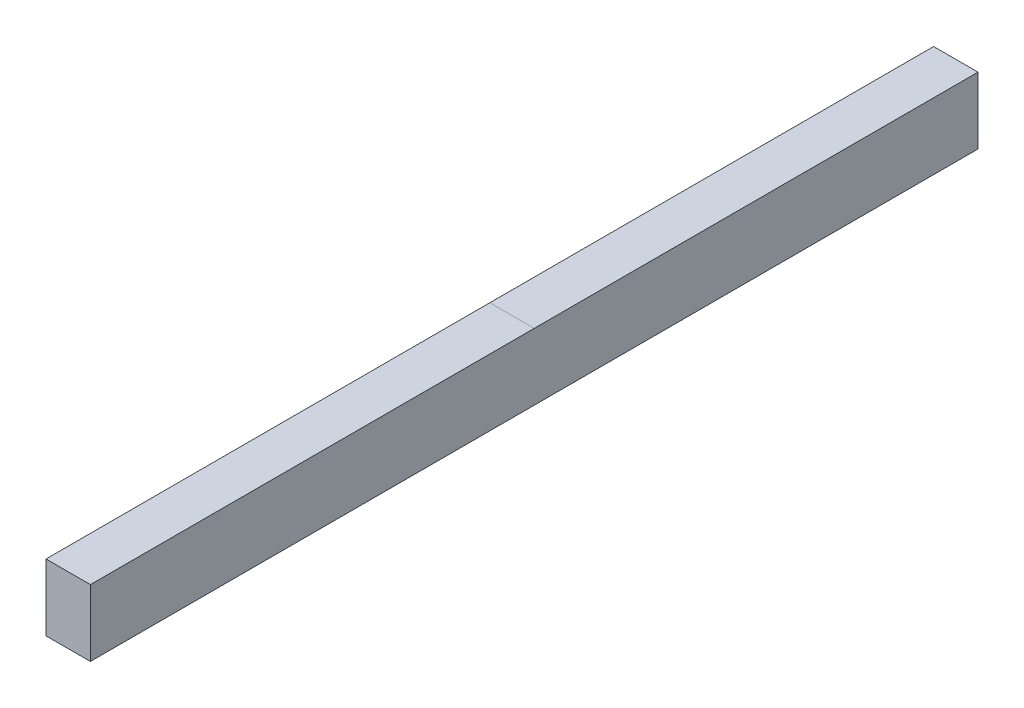
ISO-10303-21;
HEADER;
FILE_DESCRIPTION(('STEP AP214'),'2;1');
FILE_NAME('part.step','',(''),(''),'','','');
FILE_SCHEMA(('AUTOMOTIVE_DESIGN { 1 0 10303 214 1 1 1 1 }'));
ENDSEC;
DATA;
#1=APPLICATION_CONTEXT('core data for automotive mechanical design processes');
#2=APPLICATION_PROTOCOL_DEFINITION('international standard','automotive_design',2000,#1);
#3=PRODUCT_CONTEXT('',#1,'mechanical');
#4=PRODUCT('Part','Part','',(#3));
#5=PRODUCT_RELATED_PRODUCT_CATEGORY('part','',(#4));
#6=PRODUCT_DEFINITION_FORMATION('','',#4);
#7=PRODUCT_DEFINITION_CONTEXT('part definition',#1,'design');
#8=PRODUCT_DEFINITION('design','',#6,#7);
#9=PRODUCT_DEFINITION_SHAPE('','',#8);
#10=(LENGTH_UNIT() NAMED_UNIT(*) SI_UNIT(.MILLI.,.METRE.));
#11=(NAMED_UNIT(*) PLANE_ANGLE_UNIT() SI_UNIT($,.RADIAN.));
#12=(NAMED_UNIT(*) SI_UNIT($,.STERADIAN.) SOLID_ANGLE_UNIT());
#13=UNCERTAINTY_MEASURE_WITH_UNIT(LENGTH_MEASURE(1.E-05),#10,'distance_accuracy_value','');
#14=(GEOMETRIC_REPRESENTATION_CONTEXT(3) GLOBAL_UNCERTAINTY_ASSIGNED_CONTEXT((#13)) GLOBAL_UNIT_ASSIGNED_CONTEXT((#10,
#11,#12)) REPRESENTATION_CONTEXT('',''));
#15=CARTESIAN_POINT('',(0.,0.,0.));
#16=DIRECTION('',(0.,0.,1.));
#17=DIRECTION('',(1.,0.,0.));
#18=AXIS2_PLACEMENT_3D('',#15,#16,#17);
#19=CARTESIAN_POINT('',(0.,15.,200.));
#20=DIRECTION('',(0.,-1.,0.));
#21=DIRECTION('',(0.,0.,-1.));
#22=AXIS2_PLACEMENT_3D('',#19,#20,#21);
#23=PLANE('',#22);
#24=DIRECTION('',(1.,0.,0.));
#25=VECTOR('',#24,1.);
#26=CARTESIAN_POINT('',(0.,15.,100.));
#27=LINE('',#26,#25);
#28=CARTESIAN_POINT('',(0.,15.,100.));
#29=VERTEX_POINT('',#28);
#30=CARTESIAN_POINT('',(10.,15.,100.));
#31=VERTEX_POINT('',#30);
#32=EDGE_CURVE('E194',#29,#31,#27,.T.);
#33=ORIENTED_EDGE('',*,*,#32,.F.);
#34=DIRECTION('',(0.,0.,-1.));
#35=VECTOR('',#34,1.);
#36=CARTESIAN_POINT('',(0.,15.,200.));
#37=LINE('',#36,#35);
#38=CARTESIAN_POINT('',(0.,15.,200.));
#39=VERTEX_POINT('',#38);
#40=EDGE_CURVE('E181',#39,#29,#37,.T.);
#41=ORIENTED_EDGE('',*,*,#40,.F.);
#42=DIRECTION('',(-1.,0.,0.));
#43=VECTOR('',#42,1.);
#44=CARTESIAN_POINT('',(0.,15.,200.));
#45=LINE('',#44,#43);
#46=CARTESIAN_POINT('',(10.,15.,200.));
#47=VERTEX_POINT('',#46);
#48=EDGE_CURVE('E168',#47,#39,#45,.T.);
#49=ORIENTED_EDGE('',*,*,#48,.F.);
#50=DIRECTION('',(0.,0.,-1.));
#51=VECTOR('',#50,1.);
#52=CARTESIAN_POINT('',(10.,15.,200.));
#53=LINE('',#52,#51);
#54=EDGE_CURVE('E185',#47,#31,#53,.T.);
#55=ORIENTED_EDGE('',*,*,#54,.T.);
#56=EDGE_LOOP('',(#33,#41,#49,#55));
#57=FACE_BOUND('',#56,.T.);
#58=ADVANCED_FACE('F61',(#57),#23,.F.);
#59=CARTESIAN_POINT('',(0.,0.,200.));
#60=DIRECTION('',(0.,1.,0.));
#61=DIRECTION('',(0.,0.,1.));
#62=AXIS2_PLACEMENT_3D('',#59,#60,#61);
#63=PLANE('',#62);
#64=DIRECTION('',(1.,0.,0.));
#65=VECTOR('',#64,1.);
#66=CARTESIAN_POINT('',(0.,0.,0.));
#67=LINE('',#66,#65);
#68=CARTESIAN_POINT('',(0.,0.,0.));
#69=VERTEX_POINT('',#68);
#70=CARTESIAN_POINT('',(10.,0.,0.));
#71=VERTEX_POINT('',#70);
#72=EDGE_CURVE('E174',#69,#71,#67,.T.);
#73=ORIENTED_EDGE('',*,*,#72,.T.);
#74=DIRECTION('',(0.,0.,-1.));
#75=VECTOR('',#74,1.);
#76=CARTESIAN_POINT('',(10.,0.,200.));
#77=LINE('',#76,#75);
#78=CARTESIAN_POINT('',(10.,0.,200.));
#79=VERTEX_POINT('',#78);
#80=EDGE_CURVE('E188',#79,#71,#77,.T.);
#81=ORIENTED_EDGE('',*,*,#80,.F.);
#82=DIRECTION('',(1.,0.,0.));
#83=VECTOR('',#82,1.);
#84=CARTESIAN_POINT('',(0.,0.,200.));
#85=LINE('',#84,#83);
#86=CARTESIAN_POINT('',(0.,0.,200.));
#87=VERTEX_POINT('',#86);
#88=EDGE_CURVE('E163',#87,#79,#85,.T.);
#89=ORIENTED_EDGE('',*,*,#88,.F.);
#90=DIRECTION('',(0.,0.,-1.));
#91=VECTOR('',#90,1.);
#92=CARTESIAN_POINT('',(0.,0.,200.));
#93=LINE('',#92,#91);
#94=EDGE_CURVE('E191',#87,#69,#93,.T.);
#95=ORIENTED_EDGE('',*,*,#94,.T.);
#96=EDGE_LOOP('',(#73,#81,#89,#95));
#97=FACE_BOUND('',#96,.T.);
#98=ADVANCED_FACE('F234',(#97),#63,.F.);
#99=CARTESIAN_POINT('',(10.,0.,200.));
#100=DIRECTION('',(-1.,0.,0.));
#101=DIRECTION('',(0.,0.,1.));
#102=AXIS2_PLACEMENT_3D('',#99,#100,#101);
#103=PLANE('',#102);
#104=DIRECTION('',(0.,1.,0.));
#105=VECTOR('',#104,1.);
#106=CARTESIAN_POINT('',(10.,0.,0.));
#107=LINE('',#106,#105);
#108=CARTESIAN_POINT('',(10.,15.,0.));
#109=VERTEX_POINT('',#108);
#110=EDGE_CURVE('E176',#71,#109,#107,.T.);
#111=ORIENTED_EDGE('',*,*,#110,.T.);
#112=EDGE_CURVE('E184',#31,#109,#53,.T.);
#113=ORIENTED_EDGE('',*,*,#112,.F.);
#114=ORIENTED_EDGE('',*,*,#54,.F.);
#115=DIRECTION('',(0.,1.,0.));
#116=VECTOR('',#115,1.);
#117=CARTESIAN_POINT('',(10.,0.,200.));
#118=LINE('',#117,#116);
#119=EDGE_CURVE('E166',#79,#47,#118,.T.);
#120=ORIENTED_EDGE('',*,*,#119,.F.);
#121=ORIENTED_EDGE('',*,*,#80,.T.);
#122=EDGE_LOOP('',(#111,#113,#114,#120,#121));
#123=FACE_BOUND('',#122,.T.);
#124=ADVANCED_FACE('F230',(#123),#103,.F.);
#125=CARTESIAN_POINT('',(0.,15.,0.));
#126=VERTEX_POINT('',#125);
#127=EDGE_CURVE('E170',#29,#126,#37,.T.);
#128=ORIENTED_EDGE('',*,*,#127,.F.);
#129=ORIENTED_EDGE('',*,*,#32,.T.);
#130=ORIENTED_EDGE('',*,*,#112,.T.);
#131=DIRECTION('',(-1.,0.,0.));
#132=VECTOR('',#131,1.);
#133=CARTESIAN_POINT('',(0.,15.,0.));
#134=LINE('',#133,#132);
#135=EDGE_CURVE('E164',#109,#126,#134,.T.);
#136=ORIENTED_EDGE('',*,*,#135,.T.);
#137=EDGE_LOOP('',(#128,#129,#130,#136));
#138=FACE_BOUND('',#137,.T.);
#139=ADVANCED_FACE('F227',(#138),#23,.F.);
#140=CARTESIAN_POINT('',(0.,0.,200.));
#141=DIRECTION('',(1.,0.,0.));
#142=DIRECTION('',(0.,0.,-1.));
#143=AXIS2_PLACEMENT_3D('',#140,#141,#142);
#144=PLANE('',#143);
#145=DIRECTION('',(0.,-1.,0.));
#146=VECTOR('',#145,1.);
#147=CARTESIAN_POINT('',(0.,0.,0.));
#148=LINE('',#147,#146);
#149=EDGE_CURVE('E171',#126,#69,#148,.T.);
#150=ORIENTED_EDGE('',*,*,#149,.T.);
#151=ORIENTED_EDGE('',*,*,#94,.F.);
#152=DIRECTION('',(0.,-1.,0.));
#153=VECTOR('',#152,1.);
#154=CARTESIAN_POINT('',(0.,0.,200.));
#155=LINE('',#154,#153);
#156=EDGE_CURVE('E160',#39,#87,#155,.T.);
#157=ORIENTED_EDGE('',*,*,#156,.F.);
#158=ORIENTED_EDGE('',*,*,#40,.T.);
#159=ORIENTED_EDGE('',*,*,#127,.T.);
#160=EDGE_LOOP('',(#150,#151,#157,#158,#159));
#161=FACE_BOUND('',#160,.T.);
#162=ADVANCED_FACE('F225',(#161),#144,.F.);
#163=CARTESIAN_POINT('',(0.,0.,0.));
#164=DIRECTION('',(0.,0.,-1.));
#165=DIRECTION('',(-1.,0.,0.));
#166=AXIS2_PLACEMENT_3D('',#163,#164,#165);
#167=PLANE('',#166);
#168=ORIENTED_EDGE('',*,*,#149,.F.);
#169=ORIENTED_EDGE('',*,*,#135,.F.);
#170=ORIENTED_EDGE('',*,*,#110,.F.);
#171=ORIENTED_EDGE('',*,*,#72,.F.);
#172=EDGE_LOOP('',(#168,#169,#170,#171));
#173=FACE_BOUND('',#172,.T.);
#174=ADVANCED_FACE('F221',(#173),#167,.T.);
#175=CARTESIAN_POINT('',(0.,0.,200.));
#176=DIRECTION('',(0.,0.,-1.));
#177=DIRECTION('',(-1.,0.,0.));
#178=AXIS2_PLACEMENT_3D('',#175,#176,#177);
#179=PLANE('',#178);
#180=ORIENTED_EDGE('',*,*,#156,.T.);
#181=ORIENTED_EDGE('',*,*,#88,.T.);
#182=ORIENTED_EDGE('',*,*,#119,.T.);
#183=ORIENTED_EDGE('',*,*,#48,.T.);
#184=EDGE_LOOP('',(#180,#181,#182,#183));
#185=FACE_BOUND('',#184,.T.);
#186=ADVANCED_FACE('F219',(#185),#179,.F.);
#187=CLOSED_SHELL('',(#58,#98,#124,#139,#162,#174,#186));
#188=CARTESIAN_POINT('',(0.,-0.01,199.2));
#189=DIRECTION('',(0.,0.,1.));
#190=DIRECTION('',(1.,0.,0.));
#191=AXIS2_PLACEMENT_3D('',#188,#189,#190);
#192=PLANE('',#191);
#193=DIRECTION('',(1.,0.,0.));
#194=VECTOR('',#193,1.);
#195=CARTESIAN_POINT('',(0.9,14.2,199.2));
#196=LINE('',#195,#194);
#197=CARTESIAN_POINT('',(0.9,14.2,199.2));
#198=VERTEX_POINT('',#197);
#199=CARTESIAN_POINT('',(9.1,14.2,199.2));
#200=VERTEX_POINT('',#199);
#201=EDGE_CURVE('E153',#198,#200,#196,.T.);
#202=ORIENTED_EDGE('',*,*,#201,.T.);
#203=DIRECTION('',(0.,-1.,0.));
#204=VECTOR('',#203,1.);
#205=CARTESIAN_POINT('',(9.1,14.2,199.2));
#206=LINE('',#205,#204);
#207=CARTESIAN_POINT('',(9.1,0.8,199.2));
#208=VERTEX_POINT('',#207);
#209=EDGE_CURVE('E143',#200,#208,#206,.T.);
#210=ORIENTED_EDGE('',*,*,#209,.T.);
#211=DIRECTION('',(-1.,0.,0.));
#212=VECTOR('',#211,1.);
#213=CARTESIAN_POINT('',(0.900000000000002,0.8,199.2));
#214=LINE('',#213,#212);
#215=CARTESIAN_POINT('',(0.900000000000002,0.8,199.2));
#216=VERTEX_POINT('',#215);
#217=EDGE_CURVE('E149',#208,#216,#214,.T.);
#218=ORIENTED_EDGE('',*,*,#217,.T.);
#219=DIRECTION('',(0.,1.,0.));
#220=VECTOR('',#219,1.);
#221=CARTESIAN_POINT('',(0.9,14.2,199.2));
#222=LINE('',#221,#220);
#223=EDGE_CURVE('E150',#216,#198,#222,.T.);
#224=ORIENTED_EDGE('',*,*,#223,.T.);
#225=EDGE_LOOP('',(#202,#210,#218,#224));
#226=FACE_BOUND('',#225,.T.);
#227=ADVANCED_FACE('F154',(#226),#192,.F.);
#228=CARTESIAN_POINT('',(0.9,14.2,-0.01));
#229=DIRECTION('',(-1.,0.,0.));
#230=DIRECTION('',(0.,-1.,0.));
#231=AXIS2_PLACEMENT_3D('',#228,#229,#230);
#232=PLANE('',#231);
#233=DIRECTION('',(0.,0.,1.));
#234=VECTOR('',#233,1.);
#235=CARTESIAN_POINT('',(0.900000000000002,0.8,-0.01));
#236=LINE('',#235,#234);
#237=CARTESIAN_POINT('',(0.900000000000002,0.8,0.799999999999995));
#238=VERTEX_POINT('',#237);
#239=EDGE_CURVE('E197',#238,#216,#236,.T.);
#240=ORIENTED_EDGE('',*,*,#239,.F.);
#241=DIRECTION('',(0.,1.,0.));
#242=VECTOR('',#241,1.);
#243=CARTESIAN_POINT('',(0.9,14.2,0.799999999999995));
#244=LINE('',#243,#242);
#245=CARTESIAN_POINT('',(0.9,14.2,0.799999999999995));
#246=VERTEX_POINT('',#245);
#247=EDGE_CURVE('E136',#238,#246,#244,.T.);
#248=ORIENTED_EDGE('',*,*,#247,.T.);
#249=DIRECTION('',(0.,0.,1.));
#250=VECTOR('',#249,1.);
#251=CARTESIAN_POINT('',(0.9,14.2,-0.01));
#252=LINE('',#251,#250);
#253=EDGE_CURVE('E65',#246,#198,#252,.T.);
#254=ORIENTED_EDGE('',*,*,#253,.T.);
#255=ORIENTED_EDGE('',*,*,#223,.F.);
#256=EDGE_LOOP('',(#240,#248,#254,#255));
#257=FACE_BOUND('',#256,.T.);
#258=ADVANCED_FACE('F63',(#257),#232,.F.);
#259=CARTESIAN_POINT('',(0.900000000000002,0.8,-0.01));
#260=DIRECTION('',(0.,-1.,0.));
#261=DIRECTION('',(0.,0.,-1.));
#262=AXIS2_PLACEMENT_3D('',#259,#260,#261);
#263=PLANE('',#262);
#264=DIRECTION('',(0.,0.,1.));
#265=VECTOR('',#264,1.);
#266=CARTESIAN_POINT('',(9.1,0.8,-0.01));
#267=LINE('',#266,#265);
#268=CARTESIAN_POINT('',(9.1,0.8,0.799999999999995));
#269=VERTEX_POINT('',#268);
#270=EDGE_CURVE('E145',#269,#208,#267,.T.);
#271=ORIENTED_EDGE('',*,*,#270,.F.);
#272=DIRECTION('',(-1.,0.,0.));
#273=VECTOR('',#272,1.);
#274=CARTESIAN_POINT('',(0.900000000000002,0.8,0.799999999999995));
#275=LINE('',#274,#273);
#276=EDGE_CURVE('E133',#269,#238,#275,.T.);
#277=ORIENTED_EDGE('',*,*,#276,.T.);
#278=ORIENTED_EDGE('',*,*,#239,.T.);
#279=ORIENTED_EDGE('',*,*,#217,.F.);
#280=EDGE_LOOP('',(#271,#277,#278,#279));
#281=FACE_BOUND('',#280,.T.);
#282=ADVANCED_FACE('F204',(#281),#263,.F.);
#283=CARTESIAN_POINT('',(9.1,14.2,-0.01));
#284=DIRECTION('',(1.,0.,0.));
#285=DIRECTION('',(0.,1.,0.));
#286=AXIS2_PLACEMENT_3D('',#283,#284,#285);
#287=PLANE('',#286);
#288=DIRECTION('',(0.,0.,1.));
#289=VECTOR('',#288,1.);
#290=CARTESIAN_POINT('',(9.1,14.2,-0.01));
#291=LINE('',#290,#289);
#292=CARTESIAN_POINT('',(9.1,14.2,0.799999999999995));
#293=VERTEX_POINT('',#292);
#294=EDGE_CURVE('E12',#293,#200,#291,.T.);
#295=ORIENTED_EDGE('',*,*,#294,.F.);
#296=DIRECTION('',(0.,-1.,0.));
#297=VECTOR('',#296,1.);
#298=CARTESIAN_POINT('',(9.1,14.2,0.799999999999995));
#299=LINE('',#298,#297);
#300=EDGE_CURVE('E130',#293,#269,#299,.T.);
#301=ORIENTED_EDGE('',*,*,#300,.T.);
#302=ORIENTED_EDGE('',*,*,#270,.T.);
#303=ORIENTED_EDGE('',*,*,#209,.F.);
#304=EDGE_LOOP('',(#295,#301,#302,#303));
#305=FACE_BOUND('',#304,.T.);
#306=ADVANCED_FACE('F141',(#305),#287,.F.);
#307=CARTESIAN_POINT('',(0.9,14.2,-0.01));
#308=DIRECTION('',(0.,1.,0.));
#309=DIRECTION('',(0.,0.,1.));
#310=AXIS2_PLACEMENT_3D('',#307,#308,#309);
#311=PLANE('',#310);
#312=ORIENTED_EDGE('',*,*,#253,.F.);
#313=DIRECTION('',(1.,0.,0.));
#314=VECTOR('',#313,1.);
#315=CARTESIAN_POINT('',(0.9,14.2,0.799999999999995));
#316=LINE('',#315,#314);
#317=EDGE_CURVE('E77',#246,#293,#316,.T.);
#318=ORIENTED_EDGE('',*,*,#317,.T.);
#319=ORIENTED_EDGE('',*,*,#294,.T.);
#320=ORIENTED_EDGE('',*,*,#201,.F.);
#321=EDGE_LOOP('',(#312,#318,#319,#320));
#322=FACE_BOUND('',#321,.T.);
#323=ADVANCED_FACE('F139',(#322),#311,.F.);
#324=CARTESIAN_POINT('',(0.,-0.01,0.799999999999995));
#325=DIRECTION('',(0.,0.,1.));
#326=DIRECTION('',(1.,0.,0.));
#327=AXIS2_PLACEMENT_3D('',#324,#325,#326);
#328=PLANE('',#327);
#329=ORIENTED_EDGE('',*,*,#317,.F.);
#330=ORIENTED_EDGE('',*,*,#247,.F.);
#331=ORIENTED_EDGE('',*,*,#276,.F.);
#332=ORIENTED_EDGE('',*,*,#300,.F.);
#333=EDGE_LOOP('',(#329,#330,#331,#332));
#334=FACE_BOUND('',#333,.T.);
#335=ADVANCED_FACE('F131',(#334),#328,.T.);
#336=CLOSED_SHELL('',(#227,#258,#282,#306,#323,#335));
#337=ORIENTED_CLOSED_SHELL('',*,#336,.T.);
#338=BREP_WITH_VOIDS('B2',#187,(#337));
#339=CARTESIAN_POINT('',(0.,0.,0.799999999999995));
#340=DIRECTION('',(0.,0.,1.));
#341=DIRECTION('',(1.,0.,0.));
#342=AXIS2_PLACEMENT_3D('',#339,#340,#341);
#343=PLANE('',#342);
#344=DIRECTION('',(0.,1.,0.));
#345=VECTOR('',#344,1.);
#346=CARTESIAN_POINT('',(0.9,14.2,0.799999999999995));
#347=LINE('',#346,#345);
#348=CARTESIAN_POINT('',(0.900000000000002,0.8,0.799999999999995));
#349=VERTEX_POINT('',#348);
#350=CARTESIAN_POINT('',(0.9,14.2,0.799999999999995));
#351=VERTEX_POINT('',#350);
#352=EDGE_CURVE('E421',#349,#351,#347,.T.);
#353=ORIENTED_EDGE('',*,*,#352,.T.);
#354=DIRECTION('',(1.,0.,0.));
#355=VECTOR('',#354,1.);
#356=CARTESIAN_POINT('',(0.9,14.2,0.799999999999995));
#357=LINE('',#356,#355);
#358=CARTESIAN_POINT('',(9.1,14.2,0.799999999999995));
#359=VERTEX_POINT('',#358);
#360=EDGE_CURVE('E417',#351,#359,#357,.T.);
#361=ORIENTED_EDGE('',*,*,#360,.T.);
#362=DIRECTION('',(0.,-1.,0.));
#363=VECTOR('',#362,1.);
#364=CARTESIAN_POINT('',(9.1,14.2,0.799999999999995));
#365=LINE('',#364,#363);
#366=CARTESIAN_POINT('',(9.1,0.8,0.799999999999995));
#367=VERTEX_POINT('',#366);
#368=EDGE_CURVE('E415',#359,#367,#365,.T.);
#369=ORIENTED_EDGE('',*,*,#368,.T.);
#370=DIRECTION('',(-1.,0.,0.));
#371=VECTOR('',#370,1.);
#372=CARTESIAN_POINT('',(0.900000000000002,0.8,0.799999999999995));
#373=LINE('',#372,#371);
#374=EDGE_CURVE('E375',#367,#349,#373,.T.);
#375=ORIENTED_EDGE('',*,*,#374,.T.);
#376=EDGE_LOOP('',(#353,#361,#369,#375));
#377=FACE_BOUND('',#376,.T.);
#378=ADVANCED_FACE('F371',(#377),#343,.F.);
#379=CARTESIAN_POINT('',(0.,0.,199.2));
#380=DIRECTION('',(0.,0.,1.));
#381=DIRECTION('',(1.,0.,0.));
#382=AXIS2_PLACEMENT_3D('',#379,#380,#381);
#383=PLANE('',#382);
#384=DIRECTION('',(0.,1.,0.));
#385=VECTOR('',#384,1.);
#386=CARTESIAN_POINT('',(0.9,14.2,199.2));
#387=LINE('',#386,#385);
#388=CARTESIAN_POINT('',(0.900000000000002,0.8,199.2));
#389=VERTEX_POINT('',#388);
#390=CARTESIAN_POINT('',(0.9,14.2,199.2));
#391=VERTEX_POINT('',#390);
#392=EDGE_CURVE('E437',#389,#391,#387,.T.);
#393=ORIENTED_EDGE('',*,*,#392,.F.);
#394=DIRECTION('',(-1.,0.,0.));
#395=VECTOR('',#394,1.);
#396=CARTESIAN_POINT('',(0.900000000000002,0.8,199.2));
#397=LINE('',#396,#395);
#398=CARTESIAN_POINT('',(9.1,0.8,199.2));
#399=VERTEX_POINT('',#398);
#400=EDGE_CURVE('E388',#399,#389,#397,.T.);
#401=ORIENTED_EDGE('',*,*,#400,.F.);
#402=DIRECTION('',(0.,-1.,0.));
#403=VECTOR('',#402,1.);
#404=CARTESIAN_POINT('',(9.1,14.2,199.2));
#405=LINE('',#404,#403);
#406=CARTESIAN_POINT('',(9.1,14.2,199.2));
#407=VERTEX_POINT('',#406);
#408=EDGE_CURVE('E423',#407,#399,#405,.T.);
#409=ORIENTED_EDGE('',*,*,#408,.F.);
#410=DIRECTION('',(1.,0.,0.));
#411=VECTOR('',#410,1.);
#412=CARTESIAN_POINT('',(0.9,14.2,199.2));
#413=LINE('',#412,#411);
#414=EDGE_CURVE('E433',#391,#407,#413,.T.);
#415=ORIENTED_EDGE('',*,*,#414,.F.);
#416=EDGE_LOOP('',(#393,#401,#409,#415));
#417=FACE_BOUND('',#416,.T.);
#418=ADVANCED_FACE('F445',(#417),#383,.T.);
#419=CARTESIAN_POINT('',(0.9,14.2,-0.01));
#420=DIRECTION('',(0.,1.,0.));
#421=DIRECTION('',(0.,0.,1.));
#422=AXIS2_PLACEMENT_3D('',#419,#420,#421);
#423=PLANE('',#422);
#424=ORIENTED_EDGE('',*,*,#360,.F.);
#425=DIRECTION('',(0.,0.,1.));
#426=VECTOR('',#425,1.);
#427=CARTESIAN_POINT('',(0.9,14.2,-0.01));
#428=LINE('',#427,#426);
#429=EDGE_CURVE('E424',#351,#391,#428,.T.);
#430=ORIENTED_EDGE('',*,*,#429,.T.);
#431=ORIENTED_EDGE('',*,*,#414,.T.);
#432=DIRECTION('',(0.,0.,1.));
#433=VECTOR('',#432,1.);
#434=CARTESIAN_POINT('',(9.1,14.2,-0.01));
#435=LINE('',#434,#433);
#436=EDGE_CURVE('E427',#359,#407,#435,.T.);
#437=ORIENTED_EDGE('',*,*,#436,.F.);
#438=EDGE_LOOP('',(#424,#430,#431,#437));
#439=FACE_BOUND('',#438,.T.);
#440=ADVANCED_FACE('F441',(#439),#423,.T.);
#441=CARTESIAN_POINT('',(0.9,14.2,-0.01));
#442=DIRECTION('',(-1.,0.,0.));
#443=DIRECTION('',(0.,-1.,0.));
#444=AXIS2_PLACEMENT_3D('',#441,#442,#443);
#445=PLANE('',#444);
#446=ORIENTED_EDGE('',*,*,#352,.F.);
#447=DIRECTION('',(0.,0.,1.));
#448=VECTOR('',#447,1.);
#449=CARTESIAN_POINT('',(0.900000000000002,0.8,-0.01));
#450=LINE('',#449,#448);
#451=EDGE_CURVE('E58',#349,#389,#450,.T.);
#452=ORIENTED_EDGE('',*,*,#451,.T.);
#453=ORIENTED_EDGE('',*,*,#392,.T.);
#454=ORIENTED_EDGE('',*,*,#429,.F.);
#455=EDGE_LOOP('',(#446,#452,#453,#454));
#456=FACE_BOUND('',#455,.T.);
#457=ADVANCED_FACE('F436',(#456),#445,.T.);
#458=CARTESIAN_POINT('',(9.1,14.2,-0.01));
#459=DIRECTION('',(1.,0.,0.));
#460=DIRECTION('',(0.,1.,0.));
#461=AXIS2_PLACEMENT_3D('',#458,#459,#460);
#462=PLANE('',#461);
#463=ORIENTED_EDGE('',*,*,#368,.F.);
#464=ORIENTED_EDGE('',*,*,#436,.T.);
#465=ORIENTED_EDGE('',*,*,#408,.T.);
#466=DIRECTION('',(0.,0.,1.));
#467=VECTOR('',#466,1.);
#468=CARTESIAN_POINT('',(9.1,0.8,-0.01));
#469=LINE('',#468,#467);
#470=EDGE_CURVE('E380',#367,#399,#469,.T.);
#471=ORIENTED_EDGE('',*,*,#470,.F.);
#472=EDGE_LOOP('',(#463,#464,#465,#471));
#473=FACE_BOUND('',#472,.T.);
#474=ADVANCED_FACE('F422',(#473),#462,.T.);
#475=CARTESIAN_POINT('',(0.900000000000002,0.8,-0.01));
#476=DIRECTION('',(0.,-1.,0.));
#477=DIRECTION('',(0.,0.,-1.));
#478=AXIS2_PLACEMENT_3D('',#475,#476,#477);
#479=PLANE('',#478);
#480=ORIENTED_EDGE('',*,*,#374,.F.);
#481=ORIENTED_EDGE('',*,*,#470,.T.);
#482=ORIENTED_EDGE('',*,*,#400,.T.);
#483=ORIENTED_EDGE('',*,*,#451,.F.);
#484=EDGE_LOOP('',(#480,#481,#482,#483));
#485=FACE_BOUND('',#484,.T.);
#486=ADVANCED_FACE('F373',(#485),#479,.T.);
#487=CLOSED_SHELL('',(#378,#418,#440,#457,#474,#486));
#488=MANIFOLD_SOLID_BREP('B6',#487);
#489=ADVANCED_BREP_SHAPE_REPRESENTATION('',(#18,#338,#488),#14);
#490=SHAPE_DEFINITION_REPRESENTATION(#9,#489);
ENDSEC;
END-ISO-10303-21;
